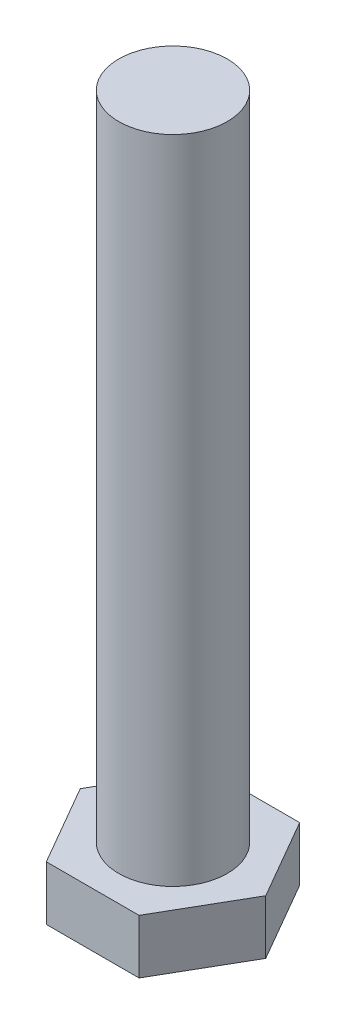
ISO-10303-21;
HEADER;
FILE_DESCRIPTION(('STEP AP214'),'2;1');
FILE_NAME('part.step','',(''),(''),'','','');
FILE_SCHEMA(('AUTOMOTIVE_DESIGN { 1 0 10303 214 1 1 1 1 }'));
ENDSEC;
DATA;
#1=APPLICATION_CONTEXT('core data for automotive mechanical design processes');
#2=APPLICATION_PROTOCOL_DEFINITION('international standard','automotive_design',2000,#1);
#3=PRODUCT_CONTEXT('',#1,'mechanical');
#4=PRODUCT('Part','Part','',(#3));
#5=PRODUCT_RELATED_PRODUCT_CATEGORY('part','',(#4));
#6=PRODUCT_DEFINITION_FORMATION('','',#4);
#7=PRODUCT_DEFINITION_CONTEXT('part definition',#1,'design');
#8=PRODUCT_DEFINITION('design','',#6,#7);
#9=PRODUCT_DEFINITION_SHAPE('','',#8);
#10=(LENGTH_UNIT() NAMED_UNIT(*) SI_UNIT(.MILLI.,.METRE.));
#11=(NAMED_UNIT(*) PLANE_ANGLE_UNIT() SI_UNIT($,.RADIAN.));
#12=(NAMED_UNIT(*) SI_UNIT($,.STERADIAN.) SOLID_ANGLE_UNIT());
#13=UNCERTAINTY_MEASURE_WITH_UNIT(LENGTH_MEASURE(1.E-05),#10,'distance_accuracy_value','');
#14=(GEOMETRIC_REPRESENTATION_CONTEXT(3) GLOBAL_UNCERTAINTY_ASSIGNED_CONTEXT((#13)) GLOBAL_UNIT_ASSIGNED_CONTEXT((#10,
#11,#12)) REPRESENTATION_CONTEXT('',''));
#15=CARTESIAN_POINT('',(0.,0.,0.));
#16=DIRECTION('',(0.,0.,1.));
#17=DIRECTION('',(1.,0.,0.));
#18=AXIS2_PLACEMENT_3D('',#15,#16,#17);
#19=CARTESIAN_POINT('',(0.,6.35,0.));
#20=DIRECTION('',(0.,1.,0.));
#21=DIRECTION('',(0.,0.,1.));
#22=AXIS2_PLACEMENT_3D('',#19,#20,#21);
#23=PLANE('',#22);
#24=DIRECTION('',(1.,0.,0.));
#25=VECTOR('',#24,1.);
#26=CARTESIAN_POINT('',(-5.4259378298441,6.35,9.398));
#27=LINE('',#26,#25);
#28=CARTESIAN_POINT('',(-5.4259378298441,6.35,9.398));
#29=VERTEX_POINT('',#28);
#30=CARTESIAN_POINT('',(5.4259378298441,6.35,9.398));
#31=VERTEX_POINT('',#30);
#32=EDGE_CURVE('E128',#29,#31,#27,.T.);
#33=ORIENTED_EDGE('',*,*,#32,.T.);
#34=DIRECTION('',(0.5,0.,-0.866025403784439));
#35=VECTOR('',#34,1.);
#36=CARTESIAN_POINT('',(5.4259378298441,6.35,9.398));
#37=LINE('',#36,#35);
#38=CARTESIAN_POINT('',(10.8518756596882,6.35,0.));
#39=VERTEX_POINT('',#38);
#40=EDGE_CURVE('E86',#31,#39,#37,.T.);
#41=ORIENTED_EDGE('',*,*,#40,.T.);
#42=DIRECTION('',(-0.5,0.,-0.866025403784438));
#43=VECTOR('',#42,1.);
#44=CARTESIAN_POINT('',(10.8518756596882,6.35,0.));
#45=LINE('',#44,#43);
#46=CARTESIAN_POINT('',(5.4259378298441,6.35,-9.398));
#47=VERTEX_POINT('',#46);
#48=EDGE_CURVE('E99',#39,#47,#45,.T.);
#49=ORIENTED_EDGE('',*,*,#48,.T.);
#50=DIRECTION('',(-1.,0.,0.));
#51=VECTOR('',#50,1.);
#52=CARTESIAN_POINT('',(5.4259378298441,6.35,-9.398));
#53=LINE('',#52,#51);
#54=CARTESIAN_POINT('',(-5.4259378298441,6.35,-9.398));
#55=VERTEX_POINT('',#54);
#56=EDGE_CURVE('E93',#47,#55,#53,.T.);
#57=ORIENTED_EDGE('',*,*,#56,.T.);
#58=DIRECTION('',(-0.5,0.,0.866025403784439));
#59=VECTOR('',#58,1.);
#60=CARTESIAN_POINT('',(-5.4259378298441,6.35,-9.398));
#61=LINE('',#60,#59);
#62=CARTESIAN_POINT('',(-10.8518756596882,6.35,0.));
#63=VERTEX_POINT('',#62);
#64=EDGE_CURVE('E97',#55,#63,#61,.T.);
#65=ORIENTED_EDGE('',*,*,#64,.T.);
#66=DIRECTION('',(0.5,0.,0.866025403784439));
#67=VECTOR('',#66,1.);
#68=CARTESIAN_POINT('',(-10.8518756596882,6.35,0.));
#69=LINE('',#68,#67);
#70=EDGE_CURVE('E49',#63,#29,#69,.T.);
#71=ORIENTED_EDGE('',*,*,#70,.T.);
#72=EDGE_LOOP('',(#33,#41,#49,#57,#65,#71));
#73=FACE_BOUND('',#72,.T.);
#74=CARTESIAN_POINT('',(0.,6.35,0.));
#75=DIRECTION('',(0.,1.,0.));
#76=DIRECTION('',(0.,0.,1.));
#77=AXIS2_PLACEMENT_3D('',#74,#75,#76);
#78=CIRCLE('',#77,6.35);
#79=CARTESIAN_POINT('',(0.,6.34999999999999,-6.35));
#80=VERTEX_POINT('',#79);
#81=EDGE_CURVE('E168',#80,#80,#78,.T.);
#82=ORIENTED_EDGE('',*,*,#81,.F.);
#83=EDGE_LOOP('',(#82));
#84=FACE_BOUND('',#83,.T.);
#85=ADVANCED_FACE('F32',(#73,#84),#23,.T.);
#86=CARTESIAN_POINT('',(-5.4259378298441,6.35,9.398));
#87=DIRECTION('',(0.,0.,-1.));
#88=DIRECTION('',(-1.,0.,0.));
#89=AXIS2_PLACEMENT_3D('',#86,#87,#88);
#90=PLANE('',#89);
#91=DIRECTION('',(1.,0.,0.));
#92=VECTOR('',#91,1.);
#93=CARTESIAN_POINT('',(-5.4259378298441,0.,9.398));
#94=LINE('',#93,#92);
#95=CARTESIAN_POINT('',(-5.4259378298441,0.,9.398));
#96=VERTEX_POINT('',#95);
#97=CARTESIAN_POINT('',(5.4259378298441,0.,9.398));
#98=VERTEX_POINT('',#97);
#99=EDGE_CURVE('E117',#96,#98,#94,.T.);
#100=ORIENTED_EDGE('',*,*,#99,.T.);
#101=DIRECTION('',(0.,-1.,0.));
#102=VECTOR('',#101,1.);
#103=CARTESIAN_POINT('',(5.4259378298441,6.35,9.398));
#104=LINE('',#103,#102);
#105=EDGE_CURVE('E11',#31,#98,#104,.T.);
#106=ORIENTED_EDGE('',*,*,#105,.F.);
#107=ORIENTED_EDGE('',*,*,#32,.F.);
#108=DIRECTION('',(0.,-1.,0.));
#109=VECTOR('',#108,1.);
#110=CARTESIAN_POINT('',(-5.4259378298441,6.35,9.398));
#111=LINE('',#110,#109);
#112=EDGE_CURVE('E113',#29,#96,#111,.T.);
#113=ORIENTED_EDGE('',*,*,#112,.T.);
#114=EDGE_LOOP('',(#100,#106,#107,#113));
#115=FACE_BOUND('',#114,.T.);
#116=ADVANCED_FACE('F34',(#115),#90,.F.);
#117=CARTESIAN_POINT('',(5.4259378298441,6.35,9.398));
#118=DIRECTION('',(-0.866025403784439,0.,-0.5));
#119=DIRECTION('',(-0.5,0.,0.866025403784439));
#120=AXIS2_PLACEMENT_3D('',#117,#118,#119);
#121=PLANE('',#120);
#122=DIRECTION('',(0.5,0.,-0.866025403784439));
#123=VECTOR('',#122,1.);
#124=CARTESIAN_POINT('',(5.4259378298441,0.,9.398));
#125=LINE('',#124,#123);
#126=CARTESIAN_POINT('',(10.8518756596882,0.,0.));
#127=VERTEX_POINT('',#126);
#128=EDGE_CURVE('E120',#98,#127,#125,.T.);
#129=ORIENTED_EDGE('',*,*,#128,.T.);
#130=DIRECTION('',(0.,-1.,0.));
#131=VECTOR('',#130,1.);
#132=CARTESIAN_POINT('',(10.8518756596882,6.35,0.));
#133=LINE('',#132,#131);
#134=EDGE_CURVE('E41',#39,#127,#133,.T.);
#135=ORIENTED_EDGE('',*,*,#134,.F.);
#136=ORIENTED_EDGE('',*,*,#40,.F.);
#137=ORIENTED_EDGE('',*,*,#105,.T.);
#138=EDGE_LOOP('',(#129,#135,#136,#137));
#139=FACE_BOUND('',#138,.T.);
#140=ADVANCED_FACE('F156',(#139),#121,.F.);
#141=CARTESIAN_POINT('',(10.8518756596882,6.35,0.));
#142=DIRECTION('',(-0.866025403784438,0.,0.5));
#143=DIRECTION('',(0.500000000000001,0.,0.866025403784438));
#144=AXIS2_PLACEMENT_3D('',#141,#142,#143);
#145=PLANE('',#144);
#146=DIRECTION('',(-0.5,0.,-0.866025403784438));
#147=VECTOR('',#146,1.);
#148=CARTESIAN_POINT('',(10.8518756596882,0.,0.));
#149=LINE('',#148,#147);
#150=CARTESIAN_POINT('',(5.4259378298441,0.,-9.398));
#151=VERTEX_POINT('',#150);
#152=EDGE_CURVE('E123',#127,#151,#149,.T.);
#153=ORIENTED_EDGE('',*,*,#152,.T.);
#154=DIRECTION('',(0.,-1.,0.));
#155=VECTOR('',#154,1.);
#156=CARTESIAN_POINT('',(5.4259378298441,6.35,-9.398));
#157=LINE('',#156,#155);
#158=EDGE_CURVE('E108',#47,#151,#157,.T.);
#159=ORIENTED_EDGE('',*,*,#158,.F.);
#160=ORIENTED_EDGE('',*,*,#48,.F.);
#161=ORIENTED_EDGE('',*,*,#134,.T.);
#162=EDGE_LOOP('',(#153,#159,#160,#161));
#163=FACE_BOUND('',#162,.T.);
#164=ADVANCED_FACE('F134',(#163),#145,.F.);
#165=CARTESIAN_POINT('',(5.4259378298441,6.35,-9.398));
#166=DIRECTION('',(0.,0.,1.));
#167=DIRECTION('',(1.,0.,0.));
#168=AXIS2_PLACEMENT_3D('',#165,#166,#167);
#169=PLANE('',#168);
#170=DIRECTION('',(-1.,0.,0.));
#171=VECTOR('',#170,1.);
#172=CARTESIAN_POINT('',(5.4259378298441,0.,-9.398));
#173=LINE('',#172,#171);
#174=CARTESIAN_POINT('',(-5.4259378298441,0.,-9.398));
#175=VERTEX_POINT('',#174);
#176=EDGE_CURVE('E107',#151,#175,#173,.T.);
#177=ORIENTED_EDGE('',*,*,#176,.T.);
#178=DIRECTION('',(0.,-1.,0.));
#179=VECTOR('',#178,1.);
#180=CARTESIAN_POINT('',(-5.4259378298441,6.35,-9.398));
#181=LINE('',#180,#179);
#182=EDGE_CURVE('E104',#55,#175,#181,.T.);
#183=ORIENTED_EDGE('',*,*,#182,.F.);
#184=ORIENTED_EDGE('',*,*,#56,.F.);
#185=ORIENTED_EDGE('',*,*,#158,.T.);
#186=EDGE_LOOP('',(#177,#183,#184,#185));
#187=FACE_BOUND('',#186,.T.);
#188=ADVANCED_FACE('F105',(#187),#169,.F.);
#189=CARTESIAN_POINT('',(-5.4259378298441,6.35,-9.398));
#190=DIRECTION('',(0.866025403784439,0.,0.5));
#191=DIRECTION('',(0.5,0.,-0.866025403784439));
#192=AXIS2_PLACEMENT_3D('',#189,#190,#191);
#193=PLANE('',#192);
#194=DIRECTION('',(-0.5,0.,0.866025403784439));
#195=VECTOR('',#194,1.);
#196=CARTESIAN_POINT('',(-5.4259378298441,0.,-9.398));
#197=LINE('',#196,#195);
#198=CARTESIAN_POINT('',(-10.8518756596882,0.,0.));
#199=VERTEX_POINT('',#198);
#200=EDGE_CURVE('E72',#175,#199,#197,.T.);
#201=ORIENTED_EDGE('',*,*,#200,.T.);
#202=DIRECTION('',(0.,-1.,0.));
#203=VECTOR('',#202,1.);
#204=CARTESIAN_POINT('',(-10.8518756596882,6.35,0.));
#205=LINE('',#204,#203);
#206=EDGE_CURVE('E109',#63,#199,#205,.T.);
#207=ORIENTED_EDGE('',*,*,#206,.F.);
#208=ORIENTED_EDGE('',*,*,#64,.F.);
#209=ORIENTED_EDGE('',*,*,#182,.T.);
#210=EDGE_LOOP('',(#201,#207,#208,#209));
#211=FACE_BOUND('',#210,.T.);
#212=ADVANCED_FACE('F111',(#211),#193,.F.);
#213=CARTESIAN_POINT('',(-10.8518756596882,6.35,0.));
#214=DIRECTION('',(0.866025403784439,0.,-0.5));
#215=DIRECTION('',(-0.5,0.,-0.866025403784439));
#216=AXIS2_PLACEMENT_3D('',#213,#214,#215);
#217=PLANE('',#216);
#218=DIRECTION('',(0.5,0.,0.866025403784439));
#219=VECTOR('',#218,1.);
#220=CARTESIAN_POINT('',(-10.8518756596882,0.,0.));
#221=LINE('',#220,#219);
#222=EDGE_CURVE('E78',#199,#96,#221,.T.);
#223=ORIENTED_EDGE('',*,*,#222,.T.);
#224=ORIENTED_EDGE('',*,*,#112,.F.);
#225=ORIENTED_EDGE('',*,*,#70,.F.);
#226=ORIENTED_EDGE('',*,*,#206,.T.);
#227=EDGE_LOOP('',(#223,#224,#225,#226));
#228=FACE_BOUND('',#227,.T.);
#229=ADVANCED_FACE('F141',(#228),#217,.F.);
#230=CARTESIAN_POINT('',(0.,0.,0.));
#231=DIRECTION('',(0.,1.,0.));
#232=DIRECTION('',(0.,0.,1.));
#233=AXIS2_PLACEMENT_3D('',#230,#231,#232);
#234=PLANE('',#233);
#235=ORIENTED_EDGE('',*,*,#99,.F.);
#236=ORIENTED_EDGE('',*,*,#222,.F.);
#237=ORIENTED_EDGE('',*,*,#200,.F.);
#238=ORIENTED_EDGE('',*,*,#176,.F.);
#239=ORIENTED_EDGE('',*,*,#152,.F.);
#240=ORIENTED_EDGE('',*,*,#128,.F.);
#241=EDGE_LOOP('',(#235,#236,#237,#238,#239,#240));
#242=FACE_BOUND('',#241,.T.);
#243=ADVANCED_FACE('F137',(#242),#234,.F.);
#244=CARTESIAN_POINT('',(0.,82.55,0.));
#245=DIRECTION('',(0.,-1.,0.));
#246=DIRECTION('',(0.,0.,-1.));
#247=AXIS2_PLACEMENT_3D('',#244,#245,#246);
#248=CYLINDRICAL_SURFACE('',#247,6.35);
#249=CARTESIAN_POINT('',(0.,82.55,0.));
#250=DIRECTION('',(0.,1.,0.));
#251=DIRECTION('',(0.,0.,1.));
#252=AXIS2_PLACEMENT_3D('',#249,#250,#251);
#253=CIRCLE('',#252,6.35);
#254=CARTESIAN_POINT('',(0.,82.55,-6.35));
#255=VERTEX_POINT('',#254);
#256=EDGE_CURVE('E121',#255,#255,#253,.T.);
#257=CARTESIAN_POINT('',(0.,82.55,-6.35));
#258=CARTESIAN_POINT('',(0.,81.75625,-6.35));
#259=CARTESIAN_POINT('',(0.,80.9625,-6.35));
#260=CARTESIAN_POINT('',(0.,79.375,-6.35));
#261=CARTESIAN_POINT('',(0.,78.58125,-6.35));
#262=CARTESIAN_POINT('',(0.,76.99375,-6.35));
#263=CARTESIAN_POINT('',(0.,76.2,-6.35));
#264=CARTESIAN_POINT('',(0.,74.6125,-6.35));
#265=CARTESIAN_POINT('',(0.,73.81875,-6.35));
#266=CARTESIAN_POINT('',(0.,72.23125,-6.35));
#267=CARTESIAN_POINT('',(0.,71.4375,-6.35));
#268=CARTESIAN_POINT('',(0.,69.85,-6.35));
#269=CARTESIAN_POINT('',(0.,69.05625,-6.35));
#270=CARTESIAN_POINT('',(0.,67.46875,-6.35));
#271=CARTESIAN_POINT('',(0.,66.675,-6.35));
#272=CARTESIAN_POINT('',(0.,65.0875,-6.35));
#273=CARTESIAN_POINT('',(0.,64.29375,-6.35));
#274=CARTESIAN_POINT('',(0.,62.70625,-6.35));
#275=CARTESIAN_POINT('',(0.,61.9125,-6.35));
#276=CARTESIAN_POINT('',(0.,60.325,-6.35));
#277=CARTESIAN_POINT('',(0.,59.53125,-6.35));
#278=CARTESIAN_POINT('',(0.,57.94375,-6.35));
#279=CARTESIAN_POINT('',(0.,57.15,-6.35));
#280=CARTESIAN_POINT('',(0.,55.5625,-6.35));
#281=CARTESIAN_POINT('',(0.,54.76875,-6.35));
#282=CARTESIAN_POINT('',(0.,53.18125,-6.35));
#283=CARTESIAN_POINT('',(0.,52.3875,-6.35));
#284=CARTESIAN_POINT('',(0.,50.8,-6.35));
#285=CARTESIAN_POINT('',(0.,50.00625,-6.35));
#286=CARTESIAN_POINT('',(0.,48.41875,-6.35));
#287=CARTESIAN_POINT('',(0.,47.625,-6.35));
#288=CARTESIAN_POINT('',(0.,46.0375,-6.35));
#289=CARTESIAN_POINT('',(0.,45.24375,-6.35));
#290=CARTESIAN_POINT('',(0.,43.65625,-6.35));
#291=CARTESIAN_POINT('',(0.,42.8625,-6.35));
#292=CARTESIAN_POINT('',(0.,41.275,-6.35));
#293=CARTESIAN_POINT('',(0.,40.48125,-6.35));
#294=CARTESIAN_POINT('',(0.,38.89375,-6.35));
#295=CARTESIAN_POINT('',(0.,38.1,-6.35));
#296=CARTESIAN_POINT('',(0.,36.5125,-6.35));
#297=CARTESIAN_POINT('',(0.,35.71875,-6.35));
#298=CARTESIAN_POINT('',(0.,34.13125,-6.35));
#299=CARTESIAN_POINT('',(0.,33.3375,-6.35));
#300=CARTESIAN_POINT('',(0.,31.75,-6.35));
#301=CARTESIAN_POINT('',(0.,30.95625,-6.35));
#302=CARTESIAN_POINT('',(0.,29.36875,-6.35));
#303=CARTESIAN_POINT('',(0.,28.575,-6.35));
#304=CARTESIAN_POINT('',(0.,26.9875,-6.35));
#305=CARTESIAN_POINT('',(0.,26.19375,-6.35));
#306=CARTESIAN_POINT('',(0.,24.60625,-6.35));
#307=CARTESIAN_POINT('',(0.,23.8125,-6.35));
#308=CARTESIAN_POINT('',(0.,22.225,-6.35));
#309=CARTESIAN_POINT('',(0.,21.43125,-6.35));
#310=CARTESIAN_POINT('',(0.,19.84375,-6.35));
#311=CARTESIAN_POINT('',(0.,19.05,-6.35));
#312=CARTESIAN_POINT('',(0.,17.4625,-6.35));
#313=CARTESIAN_POINT('',(0.,16.66875,-6.35));
#314=CARTESIAN_POINT('',(0.,15.08125,-6.35));
#315=CARTESIAN_POINT('',(0.,14.2875,-6.35));
#316=CARTESIAN_POINT('',(0.,12.7,-6.35));
#317=CARTESIAN_POINT('',(0.,11.90625,-6.35));
#318=CARTESIAN_POINT('',(0.,10.31875,-6.35));
#319=CARTESIAN_POINT('',(0.,9.525,-6.35));
#320=CARTESIAN_POINT('',(0.,7.93749999999999,-6.35));
#321=CARTESIAN_POINT('',(0.,7.14375,-6.35));
#322=CARTESIAN_POINT('',(0.,6.34999999999999,-6.35));
#323=B_SPLINE_CURVE_WITH_KNOTS('',3,(#257,#258,#259,#260,#261,#262,#263,#264,#265,#266,#267,
#268,#269,#270,#271,#272,#273,#274,#275,#276,#277,#278,#279,#280,#281,#282,#283,#284,#285,#286,
#287,#288,#289,#290,#291,#292,#293,#294,#295,#296,#297,#298,#299,#300,#301,#302,#303,#304,#305,
#306,#307,#308,#309,#310,#311,#312,#313,#314,#315,#316,#317,#318,#319,#320,#321,#322),
.UNSPECIFIED.,.F.,.F.,(4,2,2,2,2,2,2,2,2,2,2,2,2,2,2,2,2,2,2,2,2,2,2,2,2,2,2,2,2,2,2,2,4),(0.,
2.38124999999999,4.76249999999999,7.14374999999999,9.52499999999999,11.90625,14.2875,16.66875,
19.05,21.43125,23.8125,26.19375,28.575,30.95625,33.3375,35.71875,38.1,40.48125,42.8625,45.24375,
47.625,50.00625,52.3875,54.76875,57.15,59.53125,61.9125,64.29375,66.675,69.05625,71.4375,
73.81875,76.2),.UNSPECIFIED.);
#324=EDGE_CURVE('BSEAM148',#255,#80,#323,.T.);
#325=ORIENTED_EDGE('',*,*,#256,.F.);
#326=ORIENTED_EDGE('',*,*,#81,.T.);
#327=ORIENTED_EDGE('',*,*,#324,.T.);
#328=ORIENTED_EDGE('',*,*,#324,.F.);
#329=EDGE_LOOP('',(#325,#327,#326,#328));
#330=FACE_BOUND('',#329,.T.);
#331=ADVANCED_FACE('F148',(#330),#248,.T.);
#332=CARTESIAN_POINT('',(0.,82.55,0.));
#333=DIRECTION('',(0.,1.,0.));
#334=DIRECTION('',(0.,0.,1.));
#335=AXIS2_PLACEMENT_3D('',#332,#333,#334);
#336=PLANE('',#335);
#337=ORIENTED_EDGE('',*,*,#256,.T.);
#338=EDGE_LOOP('',(#337));
#339=FACE_BOUND('',#338,.T.);
#340=ADVANCED_FACE('F160',(#339),#336,.T.);
#341=CLOSED_SHELL('',(#85,#116,#140,#164,#188,#212,#229,#243,#331,#340));
#342=MANIFOLD_SOLID_BREP('B2',#341);
#343=ADVANCED_BREP_SHAPE_REPRESENTATION('',(#18,#342),#14);
#344=SHAPE_DEFINITION_REPRESENTATION(#9,#343);
ENDSEC;
END-ISO-10303-21;
